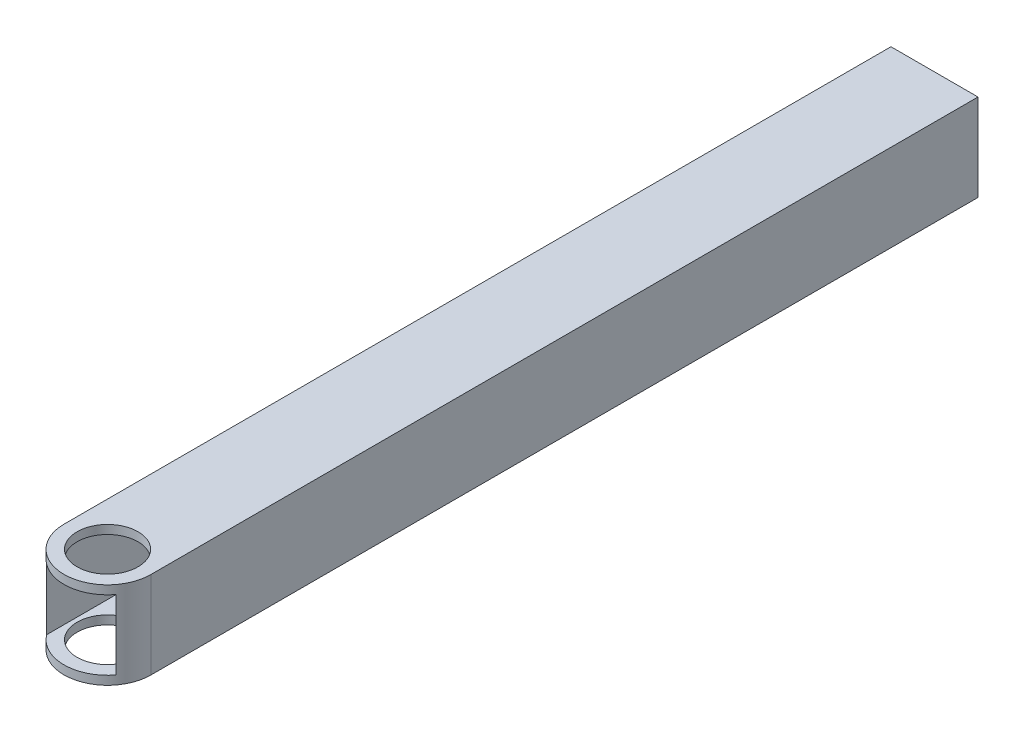
ISO-10303-21;
HEADER;
FILE_DESCRIPTION(('STEP AP214'),'2;1');
FILE_NAME('part.step','',(''),(''),'','','');
FILE_SCHEMA(('AUTOMOTIVE_DESIGN { 1 0 10303 214 1 1 1 1 }'));
ENDSEC;
DATA;
#1=APPLICATION_CONTEXT('core data for automotive mechanical design processes');
#2=APPLICATION_PROTOCOL_DEFINITION('international standard','automotive_design',2000,#1);
#3=PRODUCT_CONTEXT('',#1,'mechanical');
#4=PRODUCT('Part','Part','',(#3));
#5=PRODUCT_RELATED_PRODUCT_CATEGORY('part','',(#4));
#6=PRODUCT_DEFINITION_FORMATION('','',#4);
#7=PRODUCT_DEFINITION_CONTEXT('part definition',#1,'design');
#8=PRODUCT_DEFINITION('design','',#6,#7);
#9=PRODUCT_DEFINITION_SHAPE('','',#8);
#10=(LENGTH_UNIT() NAMED_UNIT(*) SI_UNIT(.MILLI.,.METRE.));
#11=(NAMED_UNIT(*) PLANE_ANGLE_UNIT() SI_UNIT($,.RADIAN.));
#12=(NAMED_UNIT(*) SI_UNIT($,.STERADIAN.) SOLID_ANGLE_UNIT());
#13=UNCERTAINTY_MEASURE_WITH_UNIT(LENGTH_MEASURE(1.E-05),#10,'distance_accuracy_value','');
#14=(GEOMETRIC_REPRESENTATION_CONTEXT(3) GLOBAL_UNCERTAINTY_ASSIGNED_CONTEXT((#13)) GLOBAL_UNIT_ASSIGNED_CONTEXT((#10,
#11,#12)) REPRESENTATION_CONTEXT('',''));
#15=CARTESIAN_POINT('',(0.,0.,0.));
#16=DIRECTION('',(0.,0.,1.));
#17=DIRECTION('',(1.,0.,0.));
#18=AXIS2_PLACEMENT_3D('',#15,#16,#17);
#19=CARTESIAN_POINT('',(-5.,5.,100.));
#20=DIRECTION('',(1.,0.,0.));
#21=DIRECTION('',(0.,0.,-1.));
#22=AXIS2_PLACEMENT_3D('',#19,#20,#21);
#23=PLANE('',#22);
#24=DIRECTION('',(0.,1.,0.));
#25=VECTOR('',#24,1.);
#26=CARTESIAN_POINT('',(-5.,-95.,95.));
#27=LINE('',#26,#25);
#28=CARTESIAN_POINT('',(-5.,-5.,95.));
#29=VERTEX_POINT('',#28);
#30=CARTESIAN_POINT('',(-5.,5.,95.));
#31=VERTEX_POINT('',#30);
#32=EDGE_CURVE('E103',#29,#31,#27,.T.);
#33=ORIENTED_EDGE('',*,*,#32,.T.);
#34=DIRECTION('',(0.,0.,-1.));
#35=VECTOR('',#34,1.);
#36=CARTESIAN_POINT('',(-5.,5.,100.));
#37=LINE('',#36,#35);
#38=CARTESIAN_POINT('',(-5.,5.,0.));
#39=VERTEX_POINT('',#38);
#40=EDGE_CURVE('E115',#31,#39,#37,.T.);
#41=ORIENTED_EDGE('',*,*,#40,.T.);
#42=DIRECTION('',(0.,-1.,0.));
#43=VECTOR('',#42,1.);
#44=CARTESIAN_POINT('',(-5.,5.,0.));
#45=LINE('',#44,#43);
#46=CARTESIAN_POINT('',(-5.,-5.,0.));
#47=VERTEX_POINT('',#46);
#48=EDGE_CURVE('E132',#39,#47,#45,.T.);
#49=ORIENTED_EDGE('',*,*,#48,.T.);
#50=DIRECTION('',(0.,0.,-1.));
#51=VECTOR('',#50,1.);
#52=CARTESIAN_POINT('',(-5.,-5.,100.));
#53=LINE('',#52,#51);
#54=EDGE_CURVE('E117',#29,#47,#53,.T.);
#55=ORIENTED_EDGE('',*,*,#54,.F.);
#56=EDGE_LOOP('',(#33,#41,#49,#55));
#57=FACE_BOUND('',#56,.T.);
#58=ADVANCED_FACE('F35',(#57),#23,.F.);
#59=CARTESIAN_POINT('',(-4.,4.,100.));
#60=DIRECTION('',(0.,-1.,0.));
#61=DIRECTION('',(0.,0.,-1.));
#62=AXIS2_PLACEMENT_3D('',#59,#60,#61);
#63=PLANE('',#62);
#64=CARTESIAN_POINT('',(0.,4.,95.));
#65=DIRECTION('',(0.,-1.,0.));
#66=DIRECTION('',(0.,0.,-1.));
#67=AXIS2_PLACEMENT_3D('',#64,#65,#66);
#68=CIRCLE('',#67,5.);
#69=CARTESIAN_POINT('',(-4.,4.,98.));
#70=VERTEX_POINT('',#69);
#71=CARTESIAN_POINT('',(4.,4.,98.));
#72=VERTEX_POINT('',#71);
#73=EDGE_CURVE('E166',#70,#72,#68,.F.);
#74=ORIENTED_EDGE('',*,*,#73,.F.);
#75=DIRECTION('',(0.,0.,-1.));
#76=VECTOR('',#75,1.);
#77=CARTESIAN_POINT('',(-4.,4.,100.));
#78=LINE('',#77,#76);
#79=CARTESIAN_POINT('',(-4.,4.,0.));
#80=VERTEX_POINT('',#79);
#81=EDGE_CURVE('E140',#70,#80,#78,.T.);
#82=ORIENTED_EDGE('',*,*,#81,.T.);
#83=DIRECTION('',(-1.,0.,0.));
#84=VECTOR('',#83,1.);
#85=CARTESIAN_POINT('',(-4.,4.,0.));
#86=LINE('',#85,#84);
#87=CARTESIAN_POINT('',(4.,4.,0.));
#88=VERTEX_POINT('',#87);
#89=EDGE_CURVE('E151',#88,#80,#86,.T.);
#90=ORIENTED_EDGE('',*,*,#89,.F.);
#91=DIRECTION('',(0.,0.,-1.));
#92=VECTOR('',#91,1.);
#93=CARTESIAN_POINT('',(4.,4.,100.));
#94=LINE('',#93,#92);
#95=EDGE_CURVE('E138',#72,#88,#94,.T.);
#96=ORIENTED_EDGE('',*,*,#95,.F.);
#97=EDGE_LOOP('',(#74,#82,#90,#96));
#98=FACE_BOUND('',#97,.T.);
#99=CARTESIAN_POINT('',(0.,4.,95.));
#100=DIRECTION('',(0.,-1.,0.));
#101=DIRECTION('',(0.,0.,-1.));
#102=AXIS2_PLACEMENT_3D('',#99,#100,#101);
#103=CIRCLE('',#102,3.5);
#104=CARTESIAN_POINT('',(0.,4.,91.5));
#105=VERTEX_POINT('',#104);
#106=EDGE_CURVE('E160',#105,#105,#103,.T.);
#107=ORIENTED_EDGE('',*,*,#106,.F.);
#108=EDGE_LOOP('',(#107));
#109=FACE_BOUND('',#108,.T.);
#110=ADVANCED_FACE('F189',(#98,#109),#63,.T.);
#111=CARTESIAN_POINT('',(-4.,-4.,100.));
#112=DIRECTION('',(0.,1.,0.));
#113=DIRECTION('',(0.,0.,1.));
#114=AXIS2_PLACEMENT_3D('',#111,#112,#113);
#115=PLANE('',#114);
#116=DIRECTION('',(0.,0.,-1.));
#117=VECTOR('',#116,1.);
#118=CARTESIAN_POINT('',(-4.,-4.,100.));
#119=LINE('',#118,#117);
#120=CARTESIAN_POINT('',(-4.,-4.,98.));
#121=VERTEX_POINT('',#120);
#122=CARTESIAN_POINT('',(-4.,-4.,0.));
#123=VERTEX_POINT('',#122);
#124=EDGE_CURVE('E142',#121,#123,#119,.T.);
#125=ORIENTED_EDGE('',*,*,#124,.F.);
#126=CARTESIAN_POINT('',(0.,-4.,95.));
#127=DIRECTION('',(0.,1.,0.));
#128=DIRECTION('',(0.,0.,1.));
#129=AXIS2_PLACEMENT_3D('',#126,#127,#128);
#130=CIRCLE('',#129,5.);
#131=CARTESIAN_POINT('',(4.,-4.,98.));
#132=VERTEX_POINT('',#131);
#133=EDGE_CURVE('E11',#132,#121,#130,.F.);
#134=ORIENTED_EDGE('',*,*,#133,.F.);
#135=DIRECTION('',(0.,0.,-1.));
#136=VECTOR('',#135,1.);
#137=CARTESIAN_POINT('',(4.,-4.,100.));
#138=LINE('',#137,#136);
#139=CARTESIAN_POINT('',(4.,-4.,0.));
#140=VERTEX_POINT('',#139);
#141=EDGE_CURVE('E57',#132,#140,#138,.T.);
#142=ORIENTED_EDGE('',*,*,#141,.T.);
#143=DIRECTION('',(1.,0.,0.));
#144=VECTOR('',#143,1.);
#145=CARTESIAN_POINT('',(-4.,-4.,0.));
#146=LINE('',#145,#144);
#147=EDGE_CURVE('E145',#123,#140,#146,.T.);
#148=ORIENTED_EDGE('',*,*,#147,.F.);
#149=EDGE_LOOP('',(#125,#134,#142,#148));
#150=FACE_BOUND('',#149,.T.);
#151=CARTESIAN_POINT('',(0.,-4.,95.));
#152=DIRECTION('',(0.,1.,0.));
#153=DIRECTION('',(0.,0.,1.));
#154=AXIS2_PLACEMENT_3D('',#151,#152,#153);
#155=CIRCLE('',#154,3.5);
#156=CARTESIAN_POINT('',(0.,-4.,98.5));
#157=VERTEX_POINT('',#156);
#158=EDGE_CURVE('E39',#157,#157,#155,.T.);
#159=ORIENTED_EDGE('',*,*,#158,.F.);
#160=EDGE_LOOP('',(#159));
#161=FACE_BOUND('',#160,.T.);
#162=ADVANCED_FACE('F193',(#150,#161),#115,.T.);
#163=CARTESIAN_POINT('',(0.,0.,0.));
#164=DIRECTION('',(0.,0.,1.));
#165=DIRECTION('',(1.,0.,0.));
#166=AXIS2_PLACEMENT_3D('',#163,#164,#165);
#167=PLANE('',#166);
#168=DIRECTION('',(0.,1.,0.));
#169=VECTOR('',#168,1.);
#170=CARTESIAN_POINT('',(5.,5.,0.));
#171=LINE('',#170,#169);
#172=CARTESIAN_POINT('',(5.,-5.,0.));
#173=VERTEX_POINT('',#172);
#174=CARTESIAN_POINT('',(5.,5.,0.));
#175=VERTEX_POINT('',#174);
#176=EDGE_CURVE('E135',#173,#175,#171,.T.);
#177=ORIENTED_EDGE('',*,*,#176,.F.);
#178=DIRECTION('',(1.,0.,0.));
#179=VECTOR('',#178,1.);
#180=CARTESIAN_POINT('',(-5.,-5.,0.));
#181=LINE('',#180,#179);
#182=EDGE_CURVE('E129',#47,#173,#181,.T.);
#183=ORIENTED_EDGE('',*,*,#182,.F.);
#184=ORIENTED_EDGE('',*,*,#48,.F.);
#185=DIRECTION('',(-1.,0.,0.));
#186=VECTOR('',#185,1.);
#187=CARTESIAN_POINT('',(-5.,5.,0.));
#188=LINE('',#187,#186);
#189=EDGE_CURVE('E121',#175,#39,#188,.T.);
#190=ORIENTED_EDGE('',*,*,#189,.F.);
#191=EDGE_LOOP('',(#177,#183,#184,#190));
#192=FACE_BOUND('',#191,.T.);
#193=DIRECTION('',(0.,1.,0.));
#194=VECTOR('',#193,1.);
#195=CARTESIAN_POINT('',(4.,4.,0.));
#196=LINE('',#195,#194);
#197=EDGE_CURVE('E154',#140,#88,#196,.T.);
#198=ORIENTED_EDGE('',*,*,#197,.T.);
#199=ORIENTED_EDGE('',*,*,#89,.T.);
#200=DIRECTION('',(0.,-1.,0.));
#201=VECTOR('',#200,1.);
#202=CARTESIAN_POINT('',(-4.,4.,0.));
#203=LINE('',#202,#201);
#204=EDGE_CURVE('E148',#80,#123,#203,.T.);
#205=ORIENTED_EDGE('',*,*,#204,.T.);
#206=ORIENTED_EDGE('',*,*,#147,.T.);
#207=EDGE_LOOP('',(#198,#199,#205,#206));
#208=FACE_BOUND('',#207,.T.);
#209=ADVANCED_FACE('F185',(#192,#208),#167,.F.);
#210=CARTESIAN_POINT('',(5.,5.,100.));
#211=DIRECTION('',(-1.,0.,0.));
#212=DIRECTION('',(0.,0.,1.));
#213=AXIS2_PLACEMENT_3D('',#210,#211,#212);
#214=PLANE('',#213);
#215=DIRECTION('',(0.,0.,-1.));
#216=VECTOR('',#215,1.);
#217=CARTESIAN_POINT('',(5.,5.,100.));
#218=LINE('',#217,#216);
#219=CARTESIAN_POINT('',(5.,5.,95.));
#220=VERTEX_POINT('',#219);
#221=EDGE_CURVE('E44',#220,#175,#218,.T.);
#222=ORIENTED_EDGE('',*,*,#221,.F.);
#223=DIRECTION('',(0.,1.,0.));
#224=VECTOR('',#223,1.);
#225=CARTESIAN_POINT('',(5.,-95.,95.));
#226=LINE('',#225,#224);
#227=CARTESIAN_POINT('',(5.,-5.,95.));
#228=VERTEX_POINT('',#227);
#229=EDGE_CURVE('E106',#228,#220,#226,.T.);
#230=ORIENTED_EDGE('',*,*,#229,.F.);
#231=DIRECTION('',(0.,0.,-1.));
#232=VECTOR('',#231,1.);
#233=CARTESIAN_POINT('',(5.,-5.,100.));
#234=LINE('',#233,#232);
#235=EDGE_CURVE('E125',#228,#173,#234,.T.);
#236=ORIENTED_EDGE('',*,*,#235,.T.);
#237=ORIENTED_EDGE('',*,*,#176,.T.);
#238=EDGE_LOOP('',(#222,#230,#236,#237));
#239=FACE_BOUND('',#238,.T.);
#240=ADVANCED_FACE('F37',(#239),#214,.F.);
#241=CARTESIAN_POINT('',(-5.,5.,100.));
#242=DIRECTION('',(0.,-1.,0.));
#243=DIRECTION('',(0.,0.,-1.));
#244=AXIS2_PLACEMENT_3D('',#241,#242,#243);
#245=PLANE('',#244);
#246=CARTESIAN_POINT('',(0.,5.,95.));
#247=DIRECTION('',(0.,1.,0.));
#248=DIRECTION('',(0.,0.,1.));
#249=AXIS2_PLACEMENT_3D('',#246,#247,#248);
#250=CIRCLE('',#249,3.5);
#251=CARTESIAN_POINT('',(0.,5.,98.5));
#252=VERTEX_POINT('',#251);
#253=EDGE_CURVE('E110',#252,#252,#250,.T.);
#254=ORIENTED_EDGE('',*,*,#253,.F.);
#255=EDGE_LOOP('',(#254));
#256=FACE_BOUND('',#255,.T.);
#257=ORIENTED_EDGE('',*,*,#40,.F.);
#258=CARTESIAN_POINT('',(0.,5.,95.));
#259=DIRECTION('',(0.,-1.,0.));
#260=DIRECTION('',(0.,0.,1.));
#261=AXIS2_PLACEMENT_3D('',#258,#259,#260);
#262=CIRCLE('',#261,5.);
#263=EDGE_CURVE('E100',#220,#31,#262,.T.);
#264=ORIENTED_EDGE('',*,*,#263,.F.);
#265=ORIENTED_EDGE('',*,*,#221,.T.);
#266=ORIENTED_EDGE('',*,*,#189,.T.);
#267=EDGE_LOOP('',(#257,#264,#265,#266));
#268=FACE_BOUND('',#267,.T.);
#269=ADVANCED_FACE('F119',(#256,#268),#245,.F.);
#270=CARTESIAN_POINT('',(-5.,-5.,100.));
#271=DIRECTION('',(0.,1.,0.));
#272=DIRECTION('',(0.,0.,1.));
#273=AXIS2_PLACEMENT_3D('',#270,#271,#272);
#274=PLANE('',#273);
#275=CARTESIAN_POINT('',(0.,-5.,95.));
#276=DIRECTION('',(0.,1.,0.));
#277=DIRECTION('',(0.,0.,1.));
#278=AXIS2_PLACEMENT_3D('',#275,#276,#277);
#279=CIRCLE('',#278,3.5);
#280=CARTESIAN_POINT('',(0.,-5.,98.5));
#281=VERTEX_POINT('',#280);
#282=EDGE_CURVE('E157',#281,#281,#279,.T.);
#283=ORIENTED_EDGE('',*,*,#282,.T.);
#284=EDGE_LOOP('',(#283));
#285=FACE_BOUND('',#284,.T.);
#286=ORIENTED_EDGE('',*,*,#235,.F.);
#287=CARTESIAN_POINT('',(0.,-5.,95.));
#288=DIRECTION('',(0.,1.,0.));
#289=DIRECTION('',(0.,0.,1.));
#290=AXIS2_PLACEMENT_3D('',#287,#288,#289);
#291=CIRCLE('',#290,5.);
#292=EDGE_CURVE('E163',#228,#29,#291,.F.);
#293=ORIENTED_EDGE('',*,*,#292,.T.);
#294=ORIENTED_EDGE('',*,*,#54,.T.);
#295=ORIENTED_EDGE('',*,*,#182,.T.);
#296=EDGE_LOOP('',(#286,#293,#294,#295));
#297=FACE_BOUND('',#296,.T.);
#298=ADVANCED_FACE('F177',(#285,#297),#274,.F.);
#299=CARTESIAN_POINT('',(4.,4.,100.));
#300=DIRECTION('',(-1.,0.,0.));
#301=DIRECTION('',(0.,0.,1.));
#302=AXIS2_PLACEMENT_3D('',#299,#300,#301);
#303=PLANE('',#302);
#304=DIRECTION('',(0.,1.,0.));
#305=VECTOR('',#304,1.);
#306=CARTESIAN_POINT('',(4.,-95.,98.));
#307=LINE('',#306,#305);
#308=EDGE_CURVE('E50',#72,#132,#307,.F.);
#309=ORIENTED_EDGE('',*,*,#308,.F.);
#310=ORIENTED_EDGE('',*,*,#95,.T.);
#311=ORIENTED_EDGE('',*,*,#197,.F.);
#312=ORIENTED_EDGE('',*,*,#141,.F.);
#313=EDGE_LOOP('',(#309,#310,#311,#312));
#314=FACE_BOUND('',#313,.T.);
#315=ADVANCED_FACE('F182',(#314),#303,.T.);
#316=CARTESIAN_POINT('',(-4.,4.,100.));
#317=DIRECTION('',(1.,0.,0.));
#318=DIRECTION('',(0.,0.,-1.));
#319=AXIS2_PLACEMENT_3D('',#316,#317,#318);
#320=PLANE('',#319);
#321=DIRECTION('',(0.,1.,0.));
#322=VECTOR('',#321,1.);
#323=CARTESIAN_POINT('',(-4.,-95.,98.));
#324=LINE('',#323,#322);
#325=EDGE_CURVE('E168',#121,#70,#324,.T.);
#326=ORIENTED_EDGE('',*,*,#325,.F.);
#327=ORIENTED_EDGE('',*,*,#124,.T.);
#328=ORIENTED_EDGE('',*,*,#204,.F.);
#329=ORIENTED_EDGE('',*,*,#81,.F.);
#330=EDGE_LOOP('',(#326,#327,#328,#329));
#331=FACE_BOUND('',#330,.T.);
#332=ADVANCED_FACE('F201',(#331),#320,.T.);
#333=CARTESIAN_POINT('',(0.,-95.,95.));
#334=DIRECTION('',(0.,1.,0.));
#335=DIRECTION('',(0.,0.,1.));
#336=AXIS2_PLACEMENT_3D('',#333,#334,#335);
#337=CYLINDRICAL_SURFACE('',#336,5.);
#338=ORIENTED_EDGE('',*,*,#73,.T.);
#339=ORIENTED_EDGE('',*,*,#308,.T.);
#340=ORIENTED_EDGE('',*,*,#133,.T.);
#341=ORIENTED_EDGE('',*,*,#325,.T.);
#342=EDGE_LOOP('',(#338,#339,#340,#341));
#343=FACE_BOUND('',#342,.T.);
#344=ORIENTED_EDGE('',*,*,#263,.T.);
#345=ORIENTED_EDGE('',*,*,#32,.F.);
#346=ORIENTED_EDGE('',*,*,#292,.F.);
#347=ORIENTED_EDGE('',*,*,#229,.T.);
#348=EDGE_LOOP('',(#344,#345,#346,#347));
#349=FACE_BOUND('',#348,.T.);
#350=ADVANCED_FACE('F102',(#343,#349),#337,.T.);
#351=CARTESIAN_POINT('',(0.,-95.,95.));
#352=DIRECTION('',(0.,1.,0.));
#353=DIRECTION('',(0.,0.,1.));
#354=AXIS2_PLACEMENT_3D('',#351,#352,#353);
#355=CYLINDRICAL_SURFACE('',#354,3.5);
#356=ORIENTED_EDGE('',*,*,#158,.T.);
#357=EDGE_LOOP('',(#356));
#358=FACE_BOUND('',#357,.T.);
#359=ORIENTED_EDGE('',*,*,#282,.F.);
#360=EDGE_LOOP('',(#359));
#361=FACE_BOUND('',#360,.T.);
#362=ADVANCED_FACE('F211',(#358,#361),#355,.F.);
#363=ORIENTED_EDGE('',*,*,#106,.T.);
#364=EDGE_LOOP('',(#363));
#365=FACE_BOUND('',#364,.T.);
#366=ORIENTED_EDGE('',*,*,#253,.T.);
#367=EDGE_LOOP('',(#366));
#368=FACE_BOUND('',#367,.T.);
#369=ADVANCED_FACE('F174',(#365,#368),#355,.F.);
#370=CLOSED_SHELL('',(#58,#110,#162,#209,#240,#269,#298,#315,#332,#350,#362,#369));
#371=MANIFOLD_SOLID_BREP('B2',#370);
#372=ADVANCED_BREP_SHAPE_REPRESENTATION('',(#18,#371),#14);
#373=SHAPE_DEFINITION_REPRESENTATION(#9,#372);
ENDSEC;
END-ISO-10303-21;
